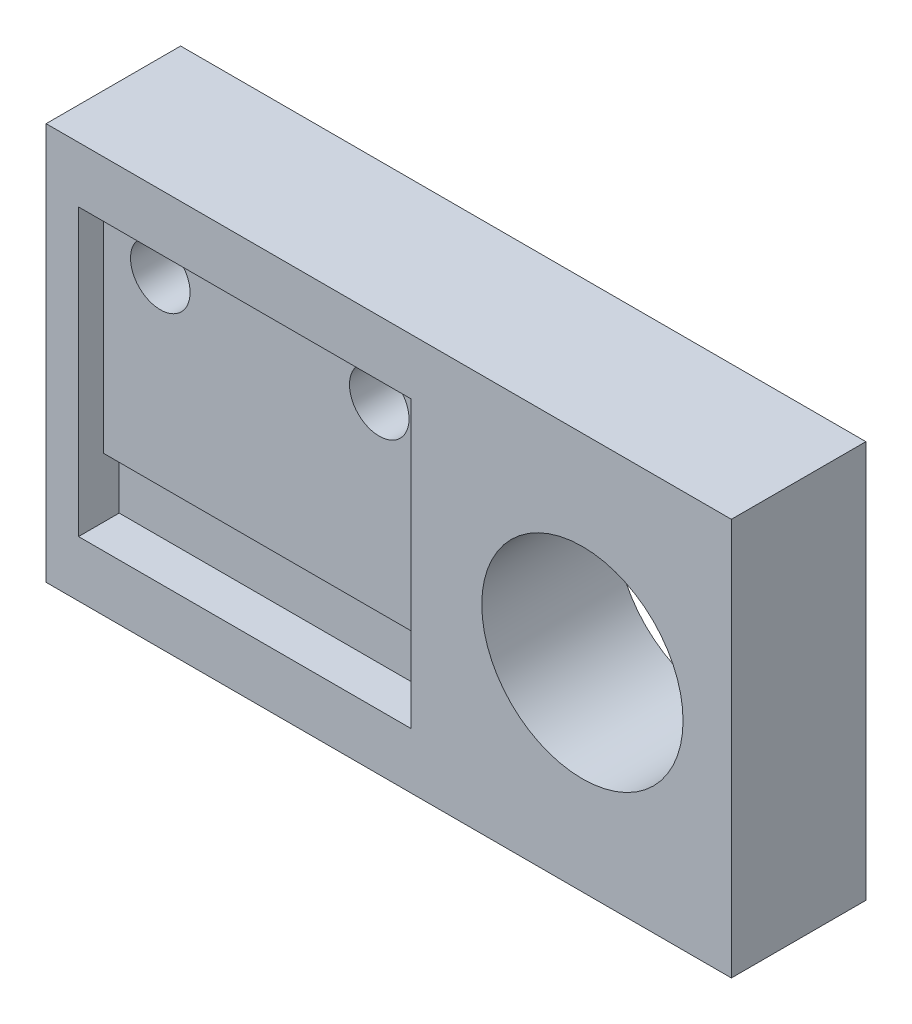
ISO-10303-21;
HEADER;
FILE_DESCRIPTION(('STEP AP214'),'2;1');
FILE_NAME('part.step','',(''),(''),'','','');
FILE_SCHEMA(('AUTOMOTIVE_DESIGN { 1 0 10303 214 1 1 1 1 }'));
ENDSEC;
DATA;
#1=APPLICATION_CONTEXT('core data for automotive mechanical design processes');
#2=APPLICATION_PROTOCOL_DEFINITION('international standard','automotive_design',2000,#1);
#3=PRODUCT_CONTEXT('',#1,'mechanical');
#4=PRODUCT('Part','Part','',(#3));
#5=PRODUCT_RELATED_PRODUCT_CATEGORY('part','',(#4));
#6=PRODUCT_DEFINITION_FORMATION('','',#4);
#7=PRODUCT_DEFINITION_CONTEXT('part definition',#1,'design');
#8=PRODUCT_DEFINITION('design','',#6,#7);
#9=PRODUCT_DEFINITION_SHAPE('','',#8);
#10=(LENGTH_UNIT() NAMED_UNIT(*) SI_UNIT(.MILLI.,.METRE.));
#11=(NAMED_UNIT(*) PLANE_ANGLE_UNIT() SI_UNIT($,.RADIAN.));
#12=(NAMED_UNIT(*) SI_UNIT($,.STERADIAN.) SOLID_ANGLE_UNIT());
#13=UNCERTAINTY_MEASURE_WITH_UNIT(LENGTH_MEASURE(1.E-05),#10,'distance_accuracy_value','');
#14=(GEOMETRIC_REPRESENTATION_CONTEXT(3) GLOBAL_UNCERTAINTY_ASSIGNED_CONTEXT((#13)) GLOBAL_UNIT_ASSIGNED_CONTEXT((#10,
#11,#12)) REPRESENTATION_CONTEXT('',''));
#15=CARTESIAN_POINT('',(0.,0.,0.));
#16=DIRECTION('',(0.,0.,1.));
#17=DIRECTION('',(1.,0.,0.));
#18=AXIS2_PLACEMENT_3D('',#15,#16,#17);
#19=CARTESIAN_POINT('',(0.,0.,0.));
#20=DIRECTION('',(0.,0.,-1.));
#21=DIRECTION('',(-1.,0.,0.));
#22=AXIS2_PLACEMENT_3D('',#19,#20,#21);
#23=PLANE('',#22);
#24=CARTESIAN_POINT('',(19.7,19.05,0.));
#25=DIRECTION('',(0.,0.,1.));
#26=DIRECTION('',(1.,0.,0.));
#27=AXIS2_PLACEMENT_3D('',#24,#25,#26);
#28=CIRCLE('',#27,1.9039967);
#29=CARTESIAN_POINT('',(21.6039967,19.05,0.));
#30=VERTEX_POINT('',#29);
#31=EDGE_CURVE('E428',#30,#30,#28,.T.);
#32=ORIENTED_EDGE('',*,*,#31,.T.);
#33=EDGE_LOOP('',(#32));
#34=FACE_BOUND('',#33,.T.);
#35=DIRECTION('',(-0.866025403784438,-0.5,0.));
#36=VECTOR('',#35,1.);
#37=CARTESIAN_POINT('',(22.8309945,17.2423194825938,0.));
#38=LINE('',#37,#36);
#39=CARTESIAN_POINT('',(22.8309945,17.2423194825938,0.));
#40=VERTEX_POINT('',#39);
#41=CARTESIAN_POINT('',(19.7,15.4346389651875,0.));
#42=VERTEX_POINT('',#41);
#43=EDGE_CURVE('E302',#40,#42,#38,.T.);
#44=ORIENTED_EDGE('',*,*,#43,.T.);
#45=DIRECTION('',(-0.866025403784438,0.5,0.));
#46=VECTOR('',#45,1.);
#47=CARTESIAN_POINT('',(19.7,15.4346389651875,0.));
#48=LINE('',#47,#46);
#49=CARTESIAN_POINT('',(16.5690055,17.2423194825938,0.));
#50=VERTEX_POINT('',#49);
#51=EDGE_CURVE('E297',#42,#50,#48,.T.);
#52=ORIENTED_EDGE('',*,*,#51,.T.);
#53=DIRECTION('',(0.,1.,0.));
#54=VECTOR('',#53,1.);
#55=CARTESIAN_POINT('',(16.5690055,17.2423194825938,0.));
#56=LINE('',#55,#54);
#57=CARTESIAN_POINT('',(16.5690055,20.8576805174062,0.));
#58=VERTEX_POINT('',#57);
#59=EDGE_CURVE('E321',#50,#58,#56,.T.);
#60=ORIENTED_EDGE('',*,*,#59,.T.);
#61=DIRECTION('',(0.866025403784439,0.5,0.));
#62=VECTOR('',#61,1.);
#63=CARTESIAN_POINT('',(16.5690055,20.8576805174062,0.));
#64=LINE('',#63,#62);
#65=CARTESIAN_POINT('',(19.7,22.6653610348125,0.));
#66=VERTEX_POINT('',#65);
#67=EDGE_CURVE('E325',#58,#66,#64,.T.);
#68=ORIENTED_EDGE('',*,*,#67,.T.);
#69=DIRECTION('',(0.866025403784439,-0.5,0.));
#70=VECTOR('',#69,1.);
#71=CARTESIAN_POINT('',(19.7,22.6653610348125,0.));
#72=LINE('',#71,#70);
#73=CARTESIAN_POINT('',(22.8309945,20.8576805174062,0.));
#74=VERTEX_POINT('',#73);
#75=EDGE_CURVE('E329',#66,#74,#72,.T.);
#76=ORIENTED_EDGE('',*,*,#75,.T.);
#77=DIRECTION('',(0.,-1.,0.));
#78=VECTOR('',#77,1.);
#79=CARTESIAN_POINT('',(22.8309945,20.8576805174062,0.));
#80=LINE('',#79,#78);
#81=EDGE_CURVE('E333',#74,#40,#80,.T.);
#82=ORIENTED_EDGE('',*,*,#81,.T.);
#83=EDGE_LOOP('',(#44,#52,#60,#68,#76,#82));
#84=FACE_BOUND('',#83,.T.);
#85=ADVANCED_FACE('F39',(#34,#84),#23,.T.);
#86=CARTESIAN_POINT('',(5.7,19.05,0.));
#87=DIRECTION('',(0.,0.,1.));
#88=DIRECTION('',(1.,0.,0.));
#89=AXIS2_PLACEMENT_3D('',#86,#87,#88);
#90=CIRCLE('',#89,1.9039967);
#91=CARTESIAN_POINT('',(7.6039967,19.05,0.));
#92=VERTEX_POINT('',#91);
#93=EDGE_CURVE('E433',#92,#92,#90,.T.);
#94=ORIENTED_EDGE('',*,*,#93,.T.);
#95=EDGE_LOOP('',(#94));
#96=FACE_BOUND('',#95,.T.);
#97=DIRECTION('',(-0.866025403784438,0.5,0.));
#98=VECTOR('',#97,1.);
#99=CARTESIAN_POINT('',(5.7,15.4346389651875,0.));
#100=LINE('',#99,#98);
#101=CARTESIAN_POINT('',(5.7,15.4346389651875,0.));
#102=VERTEX_POINT('',#101);
#103=CARTESIAN_POINT('',(2.5690055,17.2423194825938,0.));
#104=VERTEX_POINT('',#103);
#105=EDGE_CURVE('E241',#102,#104,#100,.T.);
#106=ORIENTED_EDGE('',*,*,#105,.T.);
#107=DIRECTION('',(0.,1.,0.));
#108=VECTOR('',#107,1.);
#109=CARTESIAN_POINT('',(2.5690055,17.2423194825938,0.));
#110=LINE('',#109,#108);
#111=CARTESIAN_POINT('',(2.5690055,20.8576805174062,0.));
#112=VERTEX_POINT('',#111);
#113=EDGE_CURVE('E234',#104,#112,#110,.T.);
#114=ORIENTED_EDGE('',*,*,#113,.T.);
#115=DIRECTION('',(0.866025403784439,0.5,0.));
#116=VECTOR('',#115,1.);
#117=CARTESIAN_POINT('',(2.5690055,20.8576805174062,0.));
#118=LINE('',#117,#116);
#119=CARTESIAN_POINT('',(5.69999999999999,22.6653610348125,0.));
#120=VERTEX_POINT('',#119);
#121=EDGE_CURVE('E260',#112,#120,#118,.T.);
#122=ORIENTED_EDGE('',*,*,#121,.T.);
#123=DIRECTION('',(0.866025403784439,-0.5,0.));
#124=VECTOR('',#123,1.);
#125=CARTESIAN_POINT('',(5.69999999999999,22.6653610348125,0.));
#126=LINE('',#125,#124);
#127=CARTESIAN_POINT('',(8.83099449999999,20.8576805174062,0.));
#128=VERTEX_POINT('',#127);
#129=EDGE_CURVE('E264',#120,#128,#126,.T.);
#130=ORIENTED_EDGE('',*,*,#129,.T.);
#131=DIRECTION('',(0.,-1.,0.));
#132=VECTOR('',#131,1.);
#133=CARTESIAN_POINT('',(8.83099449999999,20.8576805174062,0.));
#134=LINE('',#133,#132);
#135=CARTESIAN_POINT('',(8.83099449999999,17.2423194825938,0.));
#136=VERTEX_POINT('',#135);
#137=EDGE_CURVE('E268',#128,#136,#134,.T.);
#138=ORIENTED_EDGE('',*,*,#137,.T.);
#139=DIRECTION('',(-0.866025403784438,-0.5,0.));
#140=VECTOR('',#139,1.);
#141=CARTESIAN_POINT('',(8.83099449999999,17.2423194825938,0.));
#142=LINE('',#141,#140);
#143=EDGE_CURVE('E272',#136,#102,#142,.T.);
#144=ORIENTED_EDGE('',*,*,#143,.T.);
#145=EDGE_LOOP('',(#106,#114,#122,#130,#138,#144));
#146=FACE_BOUND('',#145,.T.);
#147=ADVANCED_FACE('F506',(#96,#146),#23,.T.);
#148=CARTESIAN_POINT('',(0.,0.,4.000000064));
#149=DIRECTION('',(0.,0.,-1.));
#150=DIRECTION('',(-1.,0.,0.));
#151=AXIS2_PLACEMENT_3D('',#148,#149,#150);
#152=PLANE('',#151);
#153=DIRECTION('',(0.,-1.,0.));
#154=VECTOR('',#153,1.);
#155=CARTESIAN_POINT('',(2.073,3.573,4.000000064));
#156=LINE('',#155,#154);
#157=CARTESIAN_POINT('',(2.073,21.827,4.000000064));
#158=VERTEX_POINT('',#157);
#159=CARTESIAN_POINT('',(2.073,7.383,4.000000064));
#160=VERTEX_POINT('',#159);
#161=EDGE_CURVE('E387',#158,#160,#156,.T.);
#162=ORIENTED_EDGE('',*,*,#161,.T.);
#163=DIRECTION('',(-1.,0.,0.));
#164=VECTOR('',#163,1.);
#165=CARTESIAN_POINT('',(2.073,7.383,4.000000064));
#166=LINE('',#165,#164);
#167=CARTESIAN_POINT('',(23.327,7.383,4.000000064));
#168=VERTEX_POINT('',#167);
#169=EDGE_CURVE('E220',#168,#160,#166,.T.);
#170=ORIENTED_EDGE('',*,*,#169,.F.);
#171=DIRECTION('',(0.,1.,0.));
#172=VECTOR('',#171,1.);
#173=CARTESIAN_POINT('',(23.327,3.573,4.000000064));
#174=LINE('',#173,#172);
#175=CARTESIAN_POINT('',(23.327,21.827,4.000000064));
#176=VERTEX_POINT('',#175);
#177=EDGE_CURVE('E382',#168,#176,#174,.T.);
#178=ORIENTED_EDGE('',*,*,#177,.T.);
#179=DIRECTION('',(-1.,0.,0.));
#180=VECTOR('',#179,1.);
#181=CARTESIAN_POINT('',(2.073,21.827,4.000000064));
#182=LINE('',#181,#180);
#183=EDGE_CURVE('E397',#176,#158,#182,.T.);
#184=ORIENTED_EDGE('',*,*,#183,.T.);
#185=EDGE_LOOP('',(#162,#170,#178,#184));
#186=FACE_BOUND('',#185,.T.);
#187=CARTESIAN_POINT('',(5.7,19.05,4.000000064));
#188=DIRECTION('',(0.,0.,1.));
#189=DIRECTION('',(1.,0.,0.));
#190=AXIS2_PLACEMENT_3D('',#187,#188,#189);
#191=CIRCLE('',#190,1.9039967);
#192=CARTESIAN_POINT('',(7.6039967,19.05,4.000000064));
#193=VERTEX_POINT('',#192);
#194=EDGE_CURVE('E437',#193,#193,#191,.T.);
#195=ORIENTED_EDGE('',*,*,#194,.F.);
#196=EDGE_LOOP('',(#195));
#197=FACE_BOUND('',#196,.T.);
#198=CARTESIAN_POINT('',(19.7,19.05,4.000000064));
#199=DIRECTION('',(0.,0.,1.));
#200=DIRECTION('',(1.,0.,0.));
#201=AXIS2_PLACEMENT_3D('',#198,#199,#200);
#202=CIRCLE('',#201,1.9039967);
#203=CARTESIAN_POINT('',(21.6039967,19.05,4.000000064));
#204=VERTEX_POINT('',#203);
#205=EDGE_CURVE('E429',#204,#204,#202,.T.);
#206=ORIENTED_EDGE('',*,*,#205,.F.);
#207=EDGE_LOOP('',(#206));
#208=FACE_BOUND('',#207,.T.);
#209=ADVANCED_FACE('F531',(#186,#197,#208),#152,.F.);
#210=CARTESIAN_POINT('',(0.,0.,4.000000064));
#211=DIRECTION('',(1.,0.,0.));
#212=DIRECTION('',(0.,0.,-1.));
#213=AXIS2_PLACEMENT_3D('',#210,#211,#212);
#214=PLANE('',#213);
#215=DIRECTION('',(0.,0.,-1.));
#216=VECTOR('',#215,1.);
#217=CARTESIAN_POINT('',(0.,25.4,4.000000064));
#218=LINE('',#217,#216);
#219=CARTESIAN_POINT('',(0.,25.4,5.600000064));
#220=VERTEX_POINT('',#219);
#221=CARTESIAN_POINT('',(0.,25.4,-3.));
#222=VERTEX_POINT('',#221);
#223=EDGE_CURVE('E441',#220,#222,#218,.T.);
#224=ORIENTED_EDGE('',*,*,#223,.T.);
#225=DIRECTION('',(0.,1.,0.));
#226=VECTOR('',#225,1.);
#227=CARTESIAN_POINT('',(0.,0.,-3.));
#228=LINE('',#227,#226);
#229=CARTESIAN_POINT('',(0.,0.,-3.));
#230=VERTEX_POINT('',#229);
#231=EDGE_CURVE('E366',#230,#222,#228,.T.);
#232=ORIENTED_EDGE('',*,*,#231,.F.);
#233=DIRECTION('',(0.,0.,-1.));
#234=VECTOR('',#233,1.);
#235=CARTESIAN_POINT('',(0.,0.,4.000000064));
#236=LINE('',#235,#234);
#237=CARTESIAN_POINT('',(0.,0.,5.600000064));
#238=VERTEX_POINT('',#237);
#239=EDGE_CURVE('E11',#238,#230,#236,.T.);
#240=ORIENTED_EDGE('',*,*,#239,.F.);
#241=DIRECTION('',(0.,-1.,0.));
#242=VECTOR('',#241,1.);
#243=CARTESIAN_POINT('',(0.,25.4,5.600000064));
#244=LINE('',#243,#242);
#245=EDGE_CURVE('E416',#220,#238,#244,.T.);
#246=ORIENTED_EDGE('',*,*,#245,.F.);
#247=EDGE_LOOP('',(#224,#232,#240,#246));
#248=FACE_BOUND('',#247,.T.);
#249=ADVANCED_FACE('F41',(#248),#214,.F.);
#250=CARTESIAN_POINT('',(0.,0.,4.000000064));
#251=DIRECTION('',(0.,1.,0.));
#252=DIRECTION('',(0.,0.,1.));
#253=AXIS2_PLACEMENT_3D('',#250,#251,#252);
#254=PLANE('',#253);
#255=ORIENTED_EDGE('',*,*,#239,.T.);
#256=DIRECTION('',(-1.,0.,0.));
#257=VECTOR('',#256,1.);
#258=CARTESIAN_POINT('',(43.815,0.,-3.));
#259=LINE('',#258,#257);
#260=CARTESIAN_POINT('',(43.815,0.,-3.));
#261=VERTEX_POINT('',#260);
#262=EDGE_CURVE('E362',#261,#230,#259,.T.);
#263=ORIENTED_EDGE('',*,*,#262,.F.);
#264=DIRECTION('',(0.,0.,-1.));
#265=VECTOR('',#264,1.);
#266=CARTESIAN_POINT('',(43.815,0.,4.000000064));
#267=LINE('',#266,#265);
#268=CARTESIAN_POINT('',(43.815,0.,5.600000064));
#269=VERTEX_POINT('',#268);
#270=EDGE_CURVE('E48',#269,#261,#267,.T.);
#271=ORIENTED_EDGE('',*,*,#270,.F.);
#272=DIRECTION('',(1.,0.,0.));
#273=VECTOR('',#272,1.);
#274=CARTESIAN_POINT('',(0.,0.,5.600000064));
#275=LINE('',#274,#273);
#276=EDGE_CURVE('E420',#238,#269,#275,.T.);
#277=ORIENTED_EDGE('',*,*,#276,.F.);
#278=EDGE_LOOP('',(#255,#263,#271,#277));
#279=FACE_BOUND('',#278,.T.);
#280=ADVANCED_FACE('F461',(#279),#254,.F.);
#281=CARTESIAN_POINT('',(43.815,0.,4.000000064));
#282=DIRECTION('',(-1.,0.,0.));
#283=DIRECTION('',(0.,0.,1.));
#284=AXIS2_PLACEMENT_3D('',#281,#282,#283);
#285=PLANE('',#284);
#286=ORIENTED_EDGE('',*,*,#270,.T.);
#287=DIRECTION('',(0.,-1.,0.));
#288=VECTOR('',#287,1.);
#289=CARTESIAN_POINT('',(43.815,25.4,-3.));
#290=LINE('',#289,#288);
#291=CARTESIAN_POINT('',(43.815,25.4,-3.));
#292=VERTEX_POINT('',#291);
#293=EDGE_CURVE('E374',#292,#261,#290,.T.);
#294=ORIENTED_EDGE('',*,*,#293,.F.);
#295=DIRECTION('',(0.,0.,-1.));
#296=VECTOR('',#295,1.);
#297=CARTESIAN_POINT('',(43.815,25.4,4.000000064));
#298=LINE('',#297,#296);
#299=CARTESIAN_POINT('',(43.815,25.4,5.600000064));
#300=VERTEX_POINT('',#299);
#301=EDGE_CURVE('E447',#300,#292,#298,.T.);
#302=ORIENTED_EDGE('',*,*,#301,.F.);
#303=DIRECTION('',(0.,1.,0.));
#304=VECTOR('',#303,1.);
#305=CARTESIAN_POINT('',(43.815,0.,5.600000064));
#306=LINE('',#305,#304);
#307=EDGE_CURVE('E424',#269,#300,#306,.T.);
#308=ORIENTED_EDGE('',*,*,#307,.F.);
#309=EDGE_LOOP('',(#286,#294,#302,#308));
#310=FACE_BOUND('',#309,.T.);
#311=ADVANCED_FACE('F453',(#310),#285,.F.);
#312=CARTESIAN_POINT('',(0.,25.4,4.000000064));
#313=DIRECTION('',(0.,-1.,0.));
#314=DIRECTION('',(0.,0.,-1.));
#315=AXIS2_PLACEMENT_3D('',#312,#313,#314);
#316=PLANE('',#315);
#317=ORIENTED_EDGE('',*,*,#301,.T.);
#318=DIRECTION('',(1.,0.,0.));
#319=VECTOR('',#318,1.);
#320=CARTESIAN_POINT('',(0.,25.4,-3.));
#321=LINE('',#320,#319);
#322=EDGE_CURVE('E370',#222,#292,#321,.T.);
#323=ORIENTED_EDGE('',*,*,#322,.F.);
#324=ORIENTED_EDGE('',*,*,#223,.F.);
#325=DIRECTION('',(-1.,0.,0.));
#326=VECTOR('',#325,1.);
#327=CARTESIAN_POINT('',(43.815,25.4,5.600000064));
#328=LINE('',#327,#326);
#329=EDGE_CURVE('E412',#300,#220,#328,.T.);
#330=ORIENTED_EDGE('',*,*,#329,.F.);
#331=EDGE_LOOP('',(#317,#323,#324,#330));
#332=FACE_BOUND('',#331,.T.);
#333=ADVANCED_FACE('F466',(#332),#316,.F.);
#334=CARTESIAN_POINT('',(5.7,19.05,4.000000064));
#335=DIRECTION('',(0.,0.,-1.));
#336=DIRECTION('',(-1.,0.,0.));
#337=AXIS2_PLACEMENT_3D('',#334,#335,#336);
#338=CYLINDRICAL_SURFACE('',#337,1.9039967);
#339=ORIENTED_EDGE('',*,*,#194,.T.);
#340=EDGE_LOOP('',(#339));
#341=FACE_BOUND('',#340,.T.);
#342=ORIENTED_EDGE('',*,*,#93,.F.);
#343=EDGE_LOOP('',(#342));
#344=FACE_BOUND('',#343,.T.);
#345=ADVANCED_FACE('F539',(#341,#344),#338,.F.);
#346=CARTESIAN_POINT('',(19.7,19.05,4.000000064));
#347=DIRECTION('',(0.,0.,-1.));
#348=DIRECTION('',(-1.,0.,0.));
#349=AXIS2_PLACEMENT_3D('',#346,#347,#348);
#350=CYLINDRICAL_SURFACE('',#349,1.9039967);
#351=ORIENTED_EDGE('',*,*,#205,.T.);
#352=EDGE_LOOP('',(#351));
#353=FACE_BOUND('',#352,.T.);
#354=ORIENTED_EDGE('',*,*,#31,.F.);
#355=EDGE_LOOP('',(#354));
#356=FACE_BOUND('',#355,.T.);
#357=ADVANCED_FACE('F480',(#353,#356),#350,.F.);
#358=CARTESIAN_POINT('',(34.29,12.7,4.000000064));
#359=DIRECTION('',(0.,0.,-1.));
#360=DIRECTION('',(-1.,0.,0.));
#361=AXIS2_PLACEMENT_3D('',#358,#359,#360);
#362=CYLINDRICAL_SURFACE('',#361,6.435);
#363=CARTESIAN_POINT('',(34.29,12.7,5.600000064));
#364=DIRECTION('',(0.,0.,1.));
#365=DIRECTION('',(1.,0.,0.));
#366=AXIS2_PLACEMENT_3D('',#363,#364,#365);
#367=CIRCLE('',#366,6.435);
#368=CARTESIAN_POINT('',(40.725,12.7,5.600000064));
#369=VERTEX_POINT('',#368);
#370=EDGE_CURVE('E378',#369,#369,#367,.T.);
#371=ORIENTED_EDGE('',*,*,#370,.T.);
#372=EDGE_LOOP('',(#371));
#373=FACE_BOUND('',#372,.T.);
#374=CARTESIAN_POINT('',(34.29,12.7,-3.));
#375=DIRECTION('',(0.,0.,-1.));
#376=DIRECTION('',(-1.,0.,0.));
#377=AXIS2_PLACEMENT_3D('',#374,#375,#376);
#378=CIRCLE('',#377,6.435);
#379=CARTESIAN_POINT('',(27.855,12.7,-3.));
#380=VERTEX_POINT('',#379);
#381=EDGE_CURVE('E358',#380,#380,#378,.T.);
#382=ORIENTED_EDGE('',*,*,#381,.T.);
#383=EDGE_LOOP('',(#382));
#384=FACE_BOUND('',#383,.T.);
#385=ADVANCED_FACE('F473',(#373,#384),#362,.F.);
#386=CARTESIAN_POINT('',(0.,0.,5.600000064));
#387=DIRECTION('',(0.,0.,1.));
#388=DIRECTION('',(1.,0.,0.));
#389=AXIS2_PLACEMENT_3D('',#386,#387,#388);
#390=PLANE('',#389);
#391=DIRECTION('',(-1.,0.,0.));
#392=VECTOR('',#391,1.);
#393=CARTESIAN_POINT('',(2.073,21.827,5.600000064));
#394=LINE('',#393,#392);
#395=CARTESIAN_POINT('',(23.327,21.827,5.600000064));
#396=VERTEX_POINT('',#395);
#397=CARTESIAN_POINT('',(2.073,21.827,5.600000064));
#398=VERTEX_POINT('',#397);
#399=EDGE_CURVE('E386',#396,#398,#394,.T.);
#400=ORIENTED_EDGE('',*,*,#399,.F.);
#401=DIRECTION('',(0.,1.,0.));
#402=VECTOR('',#401,1.);
#403=CARTESIAN_POINT('',(23.327,3.573,5.600000064));
#404=LINE('',#403,#402);
#405=CARTESIAN_POINT('',(23.327,3.573,5.600000064));
#406=VERTEX_POINT('',#405);
#407=EDGE_CURVE('E383',#406,#396,#404,.T.);
#408=ORIENTED_EDGE('',*,*,#407,.F.);
#409=DIRECTION('',(1.,0.,0.));
#410=VECTOR('',#409,1.);
#411=CARTESIAN_POINT('',(2.073,3.573,5.600000064));
#412=LINE('',#411,#410);
#413=CARTESIAN_POINT('',(2.073,3.573,5.600000064));
#414=VERTEX_POINT('',#413);
#415=EDGE_CURVE('E392',#414,#406,#412,.T.);
#416=ORIENTED_EDGE('',*,*,#415,.F.);
#417=DIRECTION('',(0.,-1.,0.));
#418=VECTOR('',#417,1.);
#419=CARTESIAN_POINT('',(2.073,3.573,5.600000064));
#420=LINE('',#419,#418);
#421=EDGE_CURVE('E199',#398,#414,#420,.T.);
#422=ORIENTED_EDGE('',*,*,#421,.F.);
#423=EDGE_LOOP('',(#400,#408,#416,#422));
#424=FACE_BOUND('',#423,.T.);
#425=ORIENTED_EDGE('',*,*,#329,.T.);
#426=ORIENTED_EDGE('',*,*,#245,.T.);
#427=ORIENTED_EDGE('',*,*,#276,.T.);
#428=ORIENTED_EDGE('',*,*,#307,.T.);
#429=EDGE_LOOP('',(#425,#426,#427,#428));
#430=FACE_BOUND('',#429,.T.);
#431=ORIENTED_EDGE('',*,*,#370,.F.);
#432=EDGE_LOOP('',(#431));
#433=FACE_BOUND('',#432,.T.);
#434=ADVANCED_FACE('F469',(#424,#430,#433),#390,.T.);
#435=CARTESIAN_POINT('',(23.327,3.573,5.600000064));
#436=DIRECTION('',(-1.,0.,0.));
#437=DIRECTION('',(0.,0.,1.));
#438=AXIS2_PLACEMENT_3D('',#435,#436,#437);
#439=PLANE('',#438);
#440=ORIENTED_EDGE('',*,*,#177,.F.);
#441=DIRECTION('',(0.,0.,1.));
#442=VECTOR('',#441,1.);
#443=CARTESIAN_POINT('',(23.327,7.383,3.000000064));
#444=LINE('',#443,#442);
#445=CARTESIAN_POINT('',(23.327,7.383,3.000000064));
#446=VERTEX_POINT('',#445);
#447=EDGE_CURVE('E229',#446,#168,#444,.T.);
#448=ORIENTED_EDGE('',*,*,#447,.F.);
#449=DIRECTION('',(0.,1.,0.));
#450=VECTOR('',#449,1.);
#451=CARTESIAN_POINT('',(23.327,7.383,3.000000064));
#452=LINE('',#451,#450);
#453=CARTESIAN_POINT('',(23.327,3.573,3.000000064));
#454=VERTEX_POINT('',#453);
#455=EDGE_CURVE('E214',#454,#446,#452,.T.);
#456=ORIENTED_EDGE('',*,*,#455,.F.);
#457=DIRECTION('',(0.,0.,-1.));
#458=VECTOR('',#457,1.);
#459=CARTESIAN_POINT('',(23.327,3.573,5.600000064));
#460=LINE('',#459,#458);
#461=EDGE_CURVE('E204',#406,#454,#460,.T.);
#462=ORIENTED_EDGE('',*,*,#461,.F.);
#463=ORIENTED_EDGE('',*,*,#407,.T.);
#464=DIRECTION('',(0.,0.,-1.));
#465=VECTOR('',#464,1.);
#466=CARTESIAN_POINT('',(23.327,21.827,5.600000064));
#467=LINE('',#466,#465);
#468=EDGE_CURVE('E408',#396,#176,#467,.T.);
#469=ORIENTED_EDGE('',*,*,#468,.T.);
#470=EDGE_LOOP('',(#440,#448,#456,#462,#463,#469));
#471=FACE_BOUND('',#470,.T.);
#472=ADVANCED_FACE('F472',(#471),#439,.T.);
#473=CARTESIAN_POINT('',(2.073,21.827,5.600000064));
#474=DIRECTION('',(0.,-1.,0.));
#475=DIRECTION('',(0.,0.,-1.));
#476=AXIS2_PLACEMENT_3D('',#473,#474,#475);
#477=PLANE('',#476);
#478=ORIENTED_EDGE('',*,*,#183,.F.);
#479=ORIENTED_EDGE('',*,*,#468,.F.);
#480=ORIENTED_EDGE('',*,*,#399,.T.);
#481=DIRECTION('',(0.,0.,-1.));
#482=VECTOR('',#481,1.);
#483=CARTESIAN_POINT('',(2.073,21.827,5.600000064));
#484=LINE('',#483,#482);
#485=EDGE_CURVE('E203',#398,#158,#484,.T.);
#486=ORIENTED_EDGE('',*,*,#485,.T.);
#487=EDGE_LOOP('',(#478,#479,#480,#486));
#488=FACE_BOUND('',#487,.T.);
#489=ADVANCED_FACE('F568',(#488),#477,.T.);
#490=CARTESIAN_POINT('',(2.073,3.573,5.600000064));
#491=DIRECTION('',(1.,0.,0.));
#492=DIRECTION('',(0.,0.,-1.));
#493=AXIS2_PLACEMENT_3D('',#490,#491,#492);
#494=PLANE('',#493);
#495=ORIENTED_EDGE('',*,*,#161,.F.);
#496=ORIENTED_EDGE('',*,*,#485,.F.);
#497=ORIENTED_EDGE('',*,*,#421,.T.);
#498=DIRECTION('',(0.,0.,-1.));
#499=VECTOR('',#498,1.);
#500=CARTESIAN_POINT('',(2.073,3.573,5.600000064));
#501=LINE('',#500,#499);
#502=CARTESIAN_POINT('',(2.073,3.573,3.000000064));
#503=VERTEX_POINT('',#502);
#504=EDGE_CURVE('E190',#414,#503,#501,.T.);
#505=ORIENTED_EDGE('',*,*,#504,.T.);
#506=DIRECTION('',(0.,-1.,0.));
#507=VECTOR('',#506,1.);
#508=CARTESIAN_POINT('',(2.073,7.383,3.000000064));
#509=LINE('',#508,#507);
#510=CARTESIAN_POINT('',(2.073,7.383,3.000000064));
#511=VERTEX_POINT('',#510);
#512=EDGE_CURVE('E195',#511,#503,#509,.T.);
#513=ORIENTED_EDGE('',*,*,#512,.F.);
#514=DIRECTION('',(0.,0.,1.));
#515=VECTOR('',#514,1.);
#516=CARTESIAN_POINT('',(2.073,7.383,3.000000064));
#517=LINE('',#516,#515);
#518=EDGE_CURVE('E231',#511,#160,#517,.T.);
#519=ORIENTED_EDGE('',*,*,#518,.T.);
#520=EDGE_LOOP('',(#495,#496,#497,#505,#513,#519));
#521=FACE_BOUND('',#520,.T.);
#522=ADVANCED_FACE('F193',(#521),#494,.T.);
#523=CARTESIAN_POINT('',(2.073,3.573,5.600000064));
#524=DIRECTION('',(0.,1.,0.));
#525=DIRECTION('',(0.,0.,1.));
#526=AXIS2_PLACEMENT_3D('',#523,#524,#525);
#527=PLANE('',#526);
#528=ORIENTED_EDGE('',*,*,#461,.T.);
#529=DIRECTION('',(1.,0.,0.));
#530=VECTOR('',#529,1.);
#531=CARTESIAN_POINT('',(2.073,3.573,3.000000064));
#532=LINE('',#531,#530);
#533=EDGE_CURVE('E207',#503,#454,#532,.T.);
#534=ORIENTED_EDGE('',*,*,#533,.F.);
#535=ORIENTED_EDGE('',*,*,#504,.F.);
#536=ORIENTED_EDGE('',*,*,#415,.T.);
#537=EDGE_LOOP('',(#528,#534,#535,#536));
#538=FACE_BOUND('',#537,.T.);
#539=ADVANCED_FACE('F208',(#538),#527,.T.);
#540=CARTESIAN_POINT('',(0.,0.,-3.));
#541=DIRECTION('',(0.,0.,-1.));
#542=DIRECTION('',(-1.,0.,0.));
#543=AXIS2_PLACEMENT_3D('',#540,#541,#542);
#544=PLANE('',#543);
#545=ORIENTED_EDGE('',*,*,#262,.T.);
#546=ORIENTED_EDGE('',*,*,#231,.T.);
#547=ORIENTED_EDGE('',*,*,#322,.T.);
#548=ORIENTED_EDGE('',*,*,#293,.T.);
#549=EDGE_LOOP('',(#545,#546,#547,#548));
#550=FACE_BOUND('',#549,.T.);
#551=ORIENTED_EDGE('',*,*,#381,.F.);
#552=EDGE_LOOP('',(#551));
#553=FACE_BOUND('',#552,.T.);
#554=DIRECTION('',(0.,1.,0.));
#555=VECTOR('',#554,1.);
#556=CARTESIAN_POINT('',(16.5690055,17.2423194825938,-3.));
#557=LINE('',#556,#555);
#558=CARTESIAN_POINT('',(16.5690055,17.2423194825938,-3.));
#559=VERTEX_POINT('',#558);
#560=CARTESIAN_POINT('',(16.5690055,20.8576805174062,-3.));
#561=VERTEX_POINT('',#560);
#562=EDGE_CURVE('E301',#559,#561,#557,.T.);
#563=ORIENTED_EDGE('',*,*,#562,.F.);
#564=DIRECTION('',(-0.866025403784438,0.5,0.));
#565=VECTOR('',#564,1.);
#566=CARTESIAN_POINT('',(19.7,15.4346389651875,-3.));
#567=LINE('',#566,#565);
#568=CARTESIAN_POINT('',(19.7,15.4346389651875,-3.));
#569=VERTEX_POINT('',#568);
#570=EDGE_CURVE('E298',#569,#559,#567,.T.);
#571=ORIENTED_EDGE('',*,*,#570,.F.);
#572=DIRECTION('',(-0.866025403784438,-0.5,0.));
#573=VECTOR('',#572,1.);
#574=CARTESIAN_POINT('',(22.8309945,17.2423194825938,-3.));
#575=LINE('',#574,#573);
#576=CARTESIAN_POINT('',(22.8309945,17.2423194825938,-3.));
#577=VERTEX_POINT('',#576);
#578=EDGE_CURVE('E315',#577,#569,#575,.T.);
#579=ORIENTED_EDGE('',*,*,#578,.F.);
#580=DIRECTION('',(0.,-1.,0.));
#581=VECTOR('',#580,1.);
#582=CARTESIAN_POINT('',(22.8309945,20.8576805174062,-3.));
#583=LINE('',#582,#581);
#584=CARTESIAN_POINT('',(22.8309945,20.8576805174062,-3.));
#585=VERTEX_POINT('',#584);
#586=EDGE_CURVE('E311',#585,#577,#583,.T.);
#587=ORIENTED_EDGE('',*,*,#586,.F.);
#588=DIRECTION('',(0.866025403784439,-0.5,0.));
#589=VECTOR('',#588,1.);
#590=CARTESIAN_POINT('',(19.7,22.6653610348125,-3.));
#591=LINE('',#590,#589);
#592=CARTESIAN_POINT('',(19.7,22.6653610348125,-3.));
#593=VERTEX_POINT('',#592);
#594=EDGE_CURVE('E308',#593,#585,#591,.T.);
#595=ORIENTED_EDGE('',*,*,#594,.F.);
#596=DIRECTION('',(0.866025403784439,0.5,0.));
#597=VECTOR('',#596,1.);
#598=CARTESIAN_POINT('',(16.5690055,20.8576805174062,-3.));
#599=LINE('',#598,#597);
#600=EDGE_CURVE('E305',#561,#593,#599,.T.);
#601=ORIENTED_EDGE('',*,*,#600,.F.);
#602=EDGE_LOOP('',(#563,#571,#579,#587,#595,#601));
#603=FACE_BOUND('',#602,.T.);
#604=DIRECTION('',(0.866025403784439,0.5,0.));
#605=VECTOR('',#604,1.);
#606=CARTESIAN_POINT('',(2.5690055,20.8576805174062,-3.));
#607=LINE('',#606,#605);
#608=CARTESIAN_POINT('',(2.5690055,20.8576805174062,-3.));
#609=VERTEX_POINT('',#608);
#610=CARTESIAN_POINT('',(5.69999999999999,22.6653610348125,-3.));
#611=VERTEX_POINT('',#610);
#612=EDGE_CURVE('E240',#609,#611,#607,.T.);
#613=ORIENTED_EDGE('',*,*,#612,.F.);
#614=DIRECTION('',(0.,1.,0.));
#615=VECTOR('',#614,1.);
#616=CARTESIAN_POINT('',(2.5690055,17.2423194825938,-3.));
#617=LINE('',#616,#615);
#618=CARTESIAN_POINT('',(2.5690055,17.2423194825938,-3.));
#619=VERTEX_POINT('',#618);
#620=EDGE_CURVE('E237',#619,#609,#617,.T.);
#621=ORIENTED_EDGE('',*,*,#620,.F.);
#622=DIRECTION('',(-0.866025403784438,0.5,0.));
#623=VECTOR('',#622,1.);
#624=CARTESIAN_POINT('',(5.7,15.4346389651875,-3.));
#625=LINE('',#624,#623);
#626=CARTESIAN_POINT('',(5.7,15.4346389651875,-3.));
#627=VERTEX_POINT('',#626);
#628=EDGE_CURVE('E254',#627,#619,#625,.T.);
#629=ORIENTED_EDGE('',*,*,#628,.F.);
#630=DIRECTION('',(-0.866025403784438,-0.5,0.));
#631=VECTOR('',#630,1.);
#632=CARTESIAN_POINT('',(8.83099449999999,17.2423194825938,-3.));
#633=LINE('',#632,#631);
#634=CARTESIAN_POINT('',(8.83099449999999,17.2423194825938,-3.));
#635=VERTEX_POINT('',#634);
#636=EDGE_CURVE('E250',#635,#627,#633,.T.);
#637=ORIENTED_EDGE('',*,*,#636,.F.);
#638=DIRECTION('',(0.,-1.,0.));
#639=VECTOR('',#638,1.);
#640=CARTESIAN_POINT('',(8.83099449999999,20.8576805174062,-3.));
#641=LINE('',#640,#639);
#642=CARTESIAN_POINT('',(8.83099449999999,20.8576805174062,-3.));
#643=VERTEX_POINT('',#642);
#644=EDGE_CURVE('E247',#643,#635,#641,.T.);
#645=ORIENTED_EDGE('',*,*,#644,.F.);
#646=DIRECTION('',(0.866025403784439,-0.5,0.));
#647=VECTOR('',#646,1.);
#648=CARTESIAN_POINT('',(5.69999999999999,22.6653610348125,-3.));
#649=LINE('',#648,#647);
#650=EDGE_CURVE('E244',#611,#643,#649,.T.);
#651=ORIENTED_EDGE('',*,*,#650,.F.);
#652=EDGE_LOOP('',(#613,#621,#629,#637,#645,#651));
#653=FACE_BOUND('',#652,.T.);
#654=ADVANCED_FACE('F458',(#550,#553,#603,#653),#544,.T.);
#655=CARTESIAN_POINT('',(19.7,15.4346389651875,-3.));
#656=DIRECTION('',(0.5,0.866025403784438,0.));
#657=DIRECTION('',(-0.866025403784438,0.5,0.));
#658=AXIS2_PLACEMENT_3D('',#655,#656,#657);
#659=PLANE('',#658);
#660=ORIENTED_EDGE('',*,*,#51,.F.);
#661=DIRECTION('',(0.,0.,1.));
#662=VECTOR('',#661,1.);
#663=CARTESIAN_POINT('',(19.7,15.4346389651875,-3.));
#664=LINE('',#663,#662);
#665=EDGE_CURVE('E55',#569,#42,#664,.T.);
#666=ORIENTED_EDGE('',*,*,#665,.F.);
#667=ORIENTED_EDGE('',*,*,#570,.T.);
#668=DIRECTION('',(0.,0.,1.));
#669=VECTOR('',#668,1.);
#670=CARTESIAN_POINT('',(16.5690055,17.2423194825938,-3.));
#671=LINE('',#670,#669);
#672=EDGE_CURVE('E354',#559,#50,#671,.T.);
#673=ORIENTED_EDGE('',*,*,#672,.T.);
#674=EDGE_LOOP('',(#660,#666,#667,#673));
#675=FACE_BOUND('',#674,.T.);
#676=ADVANCED_FACE('F485',(#675),#659,.T.);
#677=CARTESIAN_POINT('',(16.5690055,17.2423194825938,-3.));
#678=DIRECTION('',(1.,0.,0.));
#679=DIRECTION('',(0.,0.,-1.));
#680=AXIS2_PLACEMENT_3D('',#677,#678,#679);
#681=PLANE('',#680);
#682=ORIENTED_EDGE('',*,*,#59,.F.);
#683=ORIENTED_EDGE('',*,*,#672,.F.);
#684=ORIENTED_EDGE('',*,*,#562,.T.);
#685=DIRECTION('',(0.,0.,1.));
#686=VECTOR('',#685,1.);
#687=CARTESIAN_POINT('',(16.5690055,20.8576805174062,-3.));
#688=LINE('',#687,#686);
#689=EDGE_CURVE('E351',#561,#58,#688,.T.);
#690=ORIENTED_EDGE('',*,*,#689,.T.);
#691=EDGE_LOOP('',(#682,#683,#684,#690));
#692=FACE_BOUND('',#691,.T.);
#693=ADVANCED_FACE('F579',(#692),#681,.T.);
#694=CARTESIAN_POINT('',(16.5690055,20.8576805174062,-3.));
#695=DIRECTION('',(0.5,-0.866025403784439,0.));
#696=DIRECTION('',(0.866025403784439,0.5,0.));
#697=AXIS2_PLACEMENT_3D('',#694,#695,#696);
#698=PLANE('',#697);
#699=ORIENTED_EDGE('',*,*,#67,.F.);
#700=ORIENTED_EDGE('',*,*,#689,.F.);
#701=ORIENTED_EDGE('',*,*,#600,.T.);
#702=DIRECTION('',(0.,0.,1.));
#703=VECTOR('',#702,1.);
#704=CARTESIAN_POINT('',(19.7,22.6653610348125,-3.));
#705=LINE('',#704,#703);
#706=EDGE_CURVE('E348',#593,#66,#705,.T.);
#707=ORIENTED_EDGE('',*,*,#706,.T.);
#708=EDGE_LOOP('',(#699,#700,#701,#707));
#709=FACE_BOUND('',#708,.T.);
#710=ADVANCED_FACE('F583',(#709),#698,.T.);
#711=CARTESIAN_POINT('',(19.7,22.6653610348125,-3.));
#712=DIRECTION('',(-0.5,-0.866025403784439,0.));
#713=DIRECTION('',(0.866025403784439,-0.5,0.));
#714=AXIS2_PLACEMENT_3D('',#711,#712,#713);
#715=PLANE('',#714);
#716=ORIENTED_EDGE('',*,*,#75,.F.);
#717=ORIENTED_EDGE('',*,*,#706,.F.);
#718=ORIENTED_EDGE('',*,*,#594,.T.);
#719=DIRECTION('',(0.,0.,1.));
#720=VECTOR('',#719,1.);
#721=CARTESIAN_POINT('',(22.8309945,20.8576805174062,-3.));
#722=LINE('',#721,#720);
#723=EDGE_CURVE('E345',#585,#74,#722,.T.);
#724=ORIENTED_EDGE('',*,*,#723,.T.);
#725=EDGE_LOOP('',(#716,#717,#718,#724));
#726=FACE_BOUND('',#725,.T.);
#727=ADVANCED_FACE('F587',(#726),#715,.T.);
#728=CARTESIAN_POINT('',(22.8309945,20.8576805174062,-3.));
#729=DIRECTION('',(-1.,0.,0.));
#730=DIRECTION('',(0.,0.,1.));
#731=AXIS2_PLACEMENT_3D('',#728,#729,#730);
#732=PLANE('',#731);
#733=ORIENTED_EDGE('',*,*,#81,.F.);
#734=ORIENTED_EDGE('',*,*,#723,.F.);
#735=ORIENTED_EDGE('',*,*,#586,.T.);
#736=DIRECTION('',(0.,0.,1.));
#737=VECTOR('',#736,1.);
#738=CARTESIAN_POINT('',(22.8309945,17.2423194825938,-3.));
#739=LINE('',#738,#737);
#740=EDGE_CURVE('E342',#577,#40,#739,.T.);
#741=ORIENTED_EDGE('',*,*,#740,.T.);
#742=EDGE_LOOP('',(#733,#734,#735,#741));
#743=FACE_BOUND('',#742,.T.);
#744=ADVANCED_FACE('F591',(#743),#732,.T.);
#745=CARTESIAN_POINT('',(22.8309945,17.2423194825938,-3.));
#746=DIRECTION('',(-0.5,0.866025403784438,0.));
#747=DIRECTION('',(-0.866025403784438,-0.5,0.));
#748=AXIS2_PLACEMENT_3D('',#745,#746,#747);
#749=PLANE('',#748);
#750=ORIENTED_EDGE('',*,*,#43,.F.);
#751=ORIENTED_EDGE('',*,*,#740,.F.);
#752=ORIENTED_EDGE('',*,*,#578,.T.);
#753=ORIENTED_EDGE('',*,*,#665,.T.);
#754=EDGE_LOOP('',(#750,#751,#752,#753));
#755=FACE_BOUND('',#754,.T.);
#756=ADVANCED_FACE('F595',(#755),#749,.T.);
#757=CARTESIAN_POINT('',(2.5690055,17.2423194825938,-3.));
#758=DIRECTION('',(1.,0.,0.));
#759=DIRECTION('',(0.,0.,-1.));
#760=AXIS2_PLACEMENT_3D('',#757,#758,#759);
#761=PLANE('',#760);
#762=ORIENTED_EDGE('',*,*,#113,.F.);
#763=DIRECTION('',(0.,0.,1.));
#764=VECTOR('',#763,1.);
#765=CARTESIAN_POINT('',(2.5690055,17.2423194825938,-3.));
#766=LINE('',#765,#764);
#767=EDGE_CURVE('E63',#619,#104,#766,.T.);
#768=ORIENTED_EDGE('',*,*,#767,.F.);
#769=ORIENTED_EDGE('',*,*,#620,.T.);
#770=DIRECTION('',(0.,0.,1.));
#771=VECTOR('',#770,1.);
#772=CARTESIAN_POINT('',(2.5690055,20.8576805174062,-3.));
#773=LINE('',#772,#771);
#774=EDGE_CURVE('E293',#609,#112,#773,.T.);
#775=ORIENTED_EDGE('',*,*,#774,.T.);
#776=EDGE_LOOP('',(#762,#768,#769,#775));
#777=FACE_BOUND('',#776,.T.);
#778=ADVANCED_FACE('F508',(#777),#761,.T.);
#779=CARTESIAN_POINT('',(2.5690055,20.8576805174062,-3.));
#780=DIRECTION('',(0.5,-0.866025403784439,0.));
#781=DIRECTION('',(0.866025403784439,0.5,0.));
#782=AXIS2_PLACEMENT_3D('',#779,#780,#781);
#783=PLANE('',#782);
#784=ORIENTED_EDGE('',*,*,#121,.F.);
#785=ORIENTED_EDGE('',*,*,#774,.F.);
#786=ORIENTED_EDGE('',*,*,#612,.T.);
#787=DIRECTION('',(0.,0.,1.));
#788=VECTOR('',#787,1.);
#789=CARTESIAN_POINT('',(5.69999999999999,22.6653610348125,-3.));
#790=LINE('',#789,#788);
#791=EDGE_CURVE('E290',#611,#120,#790,.T.);
#792=ORIENTED_EDGE('',*,*,#791,.T.);
#793=EDGE_LOOP('',(#784,#785,#786,#792));
#794=FACE_BOUND('',#793,.T.);
#795=ADVANCED_FACE('F499',(#794),#783,.T.);
#796=CARTESIAN_POINT('',(5.69999999999999,22.6653610348125,-3.));
#797=DIRECTION('',(-0.5,-0.866025403784439,0.));
#798=DIRECTION('',(0.866025403784439,-0.5,0.));
#799=AXIS2_PLACEMENT_3D('',#796,#797,#798);
#800=PLANE('',#799);
#801=ORIENTED_EDGE('',*,*,#129,.F.);
#802=ORIENTED_EDGE('',*,*,#791,.F.);
#803=ORIENTED_EDGE('',*,*,#650,.T.);
#804=DIRECTION('',(0.,0.,1.));
#805=VECTOR('',#804,1.);
#806=CARTESIAN_POINT('',(8.83099449999999,20.8576805174062,-3.));
#807=LINE('',#806,#805);
#808=EDGE_CURVE('E287',#643,#128,#807,.T.);
#809=ORIENTED_EDGE('',*,*,#808,.T.);
#810=EDGE_LOOP('',(#801,#802,#803,#809));
#811=FACE_BOUND('',#810,.T.);
#812=ADVANCED_FACE('F502',(#811),#800,.T.);
#813=CARTESIAN_POINT('',(8.83099449999999,20.8576805174062,-3.));
#814=DIRECTION('',(-1.,0.,0.));
#815=DIRECTION('',(0.,0.,1.));
#816=AXIS2_PLACEMENT_3D('',#813,#814,#815);
#817=PLANE('',#816);
#818=ORIENTED_EDGE('',*,*,#137,.F.);
#819=ORIENTED_EDGE('',*,*,#808,.F.);
#820=ORIENTED_EDGE('',*,*,#644,.T.);
#821=DIRECTION('',(0.,0.,1.));
#822=VECTOR('',#821,1.);
#823=CARTESIAN_POINT('',(8.83099449999999,17.2423194825938,-3.));
#824=LINE('',#823,#822);
#825=EDGE_CURVE('E284',#635,#136,#824,.T.);
#826=ORIENTED_EDGE('',*,*,#825,.T.);
#827=EDGE_LOOP('',(#818,#819,#820,#826));
#828=FACE_BOUND('',#827,.T.);
#829=ADVANCED_FACE('F516',(#828),#817,.T.);
#830=CARTESIAN_POINT('',(8.83099449999999,17.2423194825938,-3.));
#831=DIRECTION('',(-0.5,0.866025403784439,0.));
#832=DIRECTION('',(-0.866025403784439,-0.5,0.));
#833=AXIS2_PLACEMENT_3D('',#830,#831,#832);
#834=PLANE('',#833);
#835=ORIENTED_EDGE('',*,*,#143,.F.);
#836=ORIENTED_EDGE('',*,*,#825,.F.);
#837=ORIENTED_EDGE('',*,*,#636,.T.);
#838=DIRECTION('',(0.,0.,1.));
#839=VECTOR('',#838,1.);
#840=CARTESIAN_POINT('',(5.7,15.4346389651875,-3.));
#841=LINE('',#840,#839);
#842=EDGE_CURVE('E281',#627,#102,#841,.T.);
#843=ORIENTED_EDGE('',*,*,#842,.T.);
#844=EDGE_LOOP('',(#835,#836,#837,#843));
#845=FACE_BOUND('',#844,.T.);
#846=ADVANCED_FACE('F514',(#845),#834,.T.);
#847=CARTESIAN_POINT('',(5.7,15.4346389651875,-3.));
#848=DIRECTION('',(0.5,0.866025403784438,0.));
#849=DIRECTION('',(-0.866025403784438,0.5,0.));
#850=AXIS2_PLACEMENT_3D('',#847,#848,#849);
#851=PLANE('',#850);
#852=ORIENTED_EDGE('',*,*,#105,.F.);
#853=ORIENTED_EDGE('',*,*,#842,.F.);
#854=ORIENTED_EDGE('',*,*,#628,.T.);
#855=ORIENTED_EDGE('',*,*,#767,.T.);
#856=EDGE_LOOP('',(#852,#853,#854,#855));
#857=FACE_BOUND('',#856,.T.);
#858=ADVANCED_FACE('F510',(#857),#851,.T.);
#859=CARTESIAN_POINT('',(2.073,7.383,3.000000064));
#860=DIRECTION('',(0.,1.,0.));
#861=DIRECTION('',(0.,0.,1.));
#862=AXIS2_PLACEMENT_3D('',#859,#860,#861);
#863=PLANE('',#862);
#864=ORIENTED_EDGE('',*,*,#169,.T.);
#865=ORIENTED_EDGE('',*,*,#518,.F.);
#866=DIRECTION('',(-1.,0.,0.));
#867=VECTOR('',#866,1.);
#868=CARTESIAN_POINT('',(2.073,7.383,3.000000064));
#869=LINE('',#868,#867);
#870=EDGE_CURVE('E218',#446,#511,#869,.T.);
#871=ORIENTED_EDGE('',*,*,#870,.F.);
#872=ORIENTED_EDGE('',*,*,#447,.T.);
#873=EDGE_LOOP('',(#864,#865,#871,#872));
#874=FACE_BOUND('',#873,.T.);
#875=ADVANCED_FACE('F628',(#874),#863,.F.);
#876=CARTESIAN_POINT('',(0.,0.,3.000000064));
#877=DIRECTION('',(0.,0.,1.));
#878=DIRECTION('',(1.,0.,0.));
#879=AXIS2_PLACEMENT_3D('',#876,#877,#878);
#880=PLANE('',#879);
#881=ORIENTED_EDGE('',*,*,#512,.T.);
#882=ORIENTED_EDGE('',*,*,#533,.T.);
#883=ORIENTED_EDGE('',*,*,#455,.T.);
#884=ORIENTED_EDGE('',*,*,#870,.T.);
#885=EDGE_LOOP('',(#881,#882,#883,#884));
#886=FACE_BOUND('',#885,.T.);
#887=ADVANCED_FACE('F216',(#886),#880,.T.);
#888=CLOSED_SHELL('',(#85,#147,#209,#249,#280,#311,#333,#345,#357,#385,#434,#472,#489,#522,#539,
#654,#676,#693,#710,#727,#744,#756,#778,#795,#812,#829,#846,#858,#875,#887));
#889=MANIFOLD_SOLID_BREP('B2',#888);
#890=ADVANCED_BREP_SHAPE_REPRESENTATION('',(#18,#889),#14);
#891=SHAPE_DEFINITION_REPRESENTATION(#9,#890);
ENDSEC;
END-ISO-10303-21;
